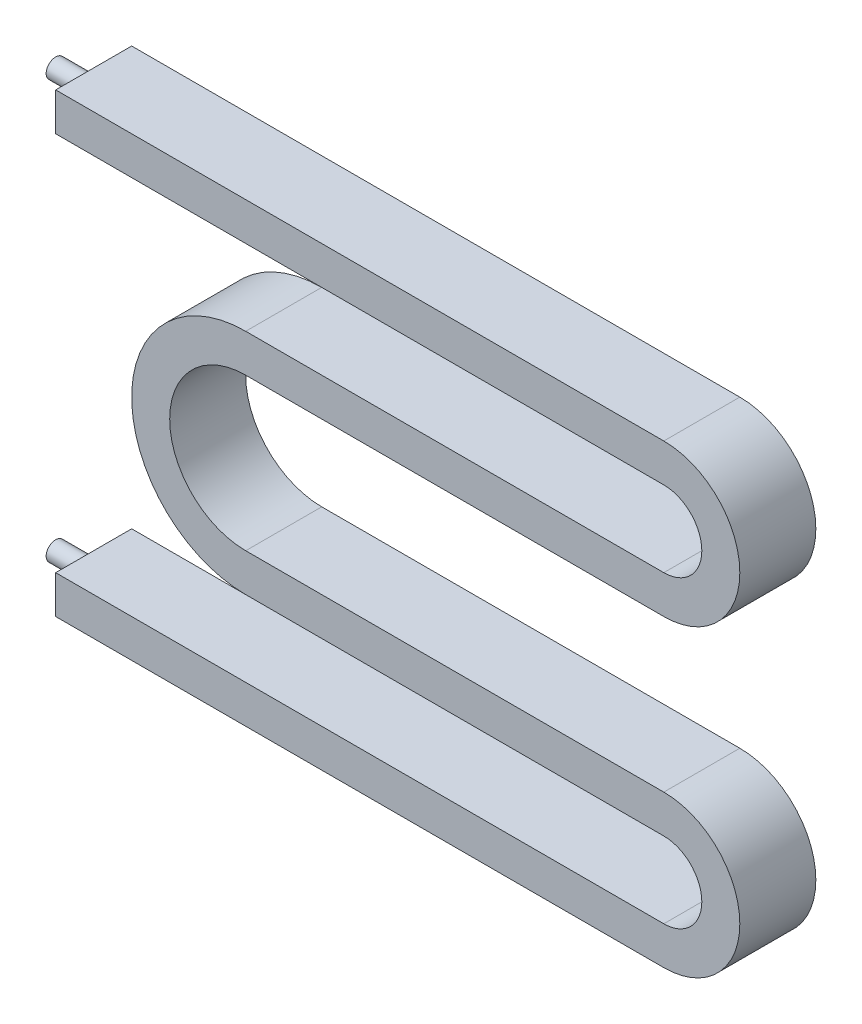
ISO-10303-21;
HEADER;
FILE_DESCRIPTION(('STEP AP214'),'2;1');
FILE_NAME('part.step','',(''),(''),'','','');
FILE_SCHEMA(('AUTOMOTIVE_DESIGN { 1 0 10303 214 1 1 1 1 }'));
ENDSEC;
DATA;
#1=APPLICATION_CONTEXT('core data for automotive mechanical design processes');
#2=APPLICATION_PROTOCOL_DEFINITION('international standard','automotive_design',2000,#1);
#3=PRODUCT_CONTEXT('',#1,'mechanical');
#4=PRODUCT('Part','Part','',(#3));
#5=PRODUCT_RELATED_PRODUCT_CATEGORY('part','',(#4));
#6=PRODUCT_DEFINITION_FORMATION('','',#4);
#7=PRODUCT_DEFINITION_CONTEXT('part definition',#1,'design');
#8=PRODUCT_DEFINITION('design','',#6,#7);
#9=PRODUCT_DEFINITION_SHAPE('','',#8);
#10=(LENGTH_UNIT() NAMED_UNIT(*) SI_UNIT(.MILLI.,.METRE.));
#11=(NAMED_UNIT(*) PLANE_ANGLE_UNIT() SI_UNIT($,.RADIAN.));
#12=(NAMED_UNIT(*) SI_UNIT($,.STERADIAN.) SOLID_ANGLE_UNIT());
#13=UNCERTAINTY_MEASURE_WITH_UNIT(LENGTH_MEASURE(1.E-05),#10,'distance_accuracy_value','');
#14=(GEOMETRIC_REPRESENTATION_CONTEXT(3) GLOBAL_UNCERTAINTY_ASSIGNED_CONTEXT((#13)) GLOBAL_UNIT_ASSIGNED_CONTEXT((#10,
#11,#12)) REPRESENTATION_CONTEXT('',''));
#15=CARTESIAN_POINT('',(0.,0.,0.));
#16=DIRECTION('',(0.,0.,1.));
#17=DIRECTION('',(1.,0.,0.));
#18=AXIS2_PLACEMENT_3D('',#15,#16,#17);
#19=CARTESIAN_POINT('',(0.,0.,10.));
#20=DIRECTION('',(1.,0.,0.));
#21=DIRECTION('',(0.,0.,-1.));
#22=AXIS2_PLACEMENT_3D('',#19,#20,#21);
#23=PLANE('',#22);
#24=CARTESIAN_POINT('',(0.,-2.5,5.));
#25=DIRECTION('',(1.,0.,0.));
#26=DIRECTION('',(0.,0.,-1.));
#27=AXIS2_PLACEMENT_3D('',#24,#25,#26);
#28=CIRCLE('',#27,1.25);
#29=CARTESIAN_POINT('',(0.,-2.5,3.75));
#30=VERTEX_POINT('',#29);
#31=EDGE_CURVE('E45',#30,#30,#28,.F.);
#32=ORIENTED_EDGE('',*,*,#31,.F.);
#33=EDGE_LOOP('',(#32));
#34=FACE_BOUND('',#33,.T.);
#35=DIRECTION('',(0.,-1.,0.));
#36=VECTOR('',#35,1.);
#37=CARTESIAN_POINT('',(0.,0.,0.));
#38=LINE('',#37,#36);
#39=CARTESIAN_POINT('',(0.,0.,0.));
#40=VERTEX_POINT('',#39);
#41=CARTESIAN_POINT('',(0.,-5.,0.));
#42=VERTEX_POINT('',#41);
#43=EDGE_CURVE('E182',#40,#42,#38,.T.);
#44=ORIENTED_EDGE('',*,*,#43,.T.);
#45=DIRECTION('',(0.,0.,-1.));
#46=VECTOR('',#45,1.);
#47=CARTESIAN_POINT('',(0.,-5.,10.));
#48=LINE('',#47,#46);
#49=CARTESIAN_POINT('',(0.,-5.,10.));
#50=VERTEX_POINT('',#49);
#51=EDGE_CURVE('E250',#50,#42,#48,.T.);
#52=ORIENTED_EDGE('',*,*,#51,.F.);
#53=DIRECTION('',(0.,-1.,0.));
#54=VECTOR('',#53,1.);
#55=CARTESIAN_POINT('',(0.,0.,10.));
#56=LINE('',#55,#54);
#57=CARTESIAN_POINT('',(0.,0.,10.));
#58=VERTEX_POINT('',#57);
#59=EDGE_CURVE('E213',#58,#50,#56,.T.);
#60=ORIENTED_EDGE('',*,*,#59,.F.);
#61=DIRECTION('',(0.,0.,-1.));
#62=VECTOR('',#61,1.);
#63=CARTESIAN_POINT('',(0.,0.,10.));
#64=LINE('',#63,#62);
#65=EDGE_CURVE('E178',#58,#40,#64,.T.);
#66=ORIENTED_EDGE('',*,*,#65,.T.);
#67=EDGE_LOOP('',(#44,#52,#60,#66));
#68=FACE_BOUND('',#67,.T.);
#69=ADVANCED_FACE('F37',(#34,#68),#23,.F.);
#70=CARTESIAN_POINT('',(0.,-5.,10.));
#71=DIRECTION('',(0.,1.,0.));
#72=DIRECTION('',(0.,0.,1.));
#73=AXIS2_PLACEMENT_3D('',#70,#71,#72);
#74=PLANE('',#73);
#75=DIRECTION('',(1.,0.,0.));
#76=VECTOR('',#75,1.);
#77=CARTESIAN_POINT('',(0.,-5.,0.));
#78=LINE('',#77,#76);
#79=CARTESIAN_POINT('',(80.,-5.,0.));
#80=VERTEX_POINT('',#79);
#81=EDGE_CURVE('E185',#42,#80,#78,.T.);
#82=ORIENTED_EDGE('',*,*,#81,.T.);
#83=DIRECTION('',(0.,0.,-1.));
#84=VECTOR('',#83,1.);
#85=CARTESIAN_POINT('',(80.,-5.,10.));
#86=LINE('',#85,#84);
#87=CARTESIAN_POINT('',(80.,-5.,10.));
#88=VERTEX_POINT('',#87);
#89=EDGE_CURVE('E247',#88,#80,#86,.T.);
#90=ORIENTED_EDGE('',*,*,#89,.F.);
#91=DIRECTION('',(1.,0.,0.));
#92=VECTOR('',#91,1.);
#93=CARTESIAN_POINT('',(0.,-5.,10.));
#94=LINE('',#93,#92);
#95=EDGE_CURVE('E121',#50,#88,#94,.T.);
#96=ORIENTED_EDGE('',*,*,#95,.F.);
#97=ORIENTED_EDGE('',*,*,#51,.T.);
#98=EDGE_LOOP('',(#82,#90,#96,#97));
#99=FACE_BOUND('',#98,.T.);
#100=ADVANCED_FACE('F258',(#99),#74,.F.);
#101=CARTESIAN_POINT('',(80.,-10.,10.));
#102=DIRECTION('',(0.,0.,-1.));
#103=DIRECTION('',(-1.,0.,0.));
#104=AXIS2_PLACEMENT_3D('',#101,#102,#103);
#105=CYLINDRICAL_SURFACE('',#104,5.);
#106=CARTESIAN_POINT('',(80.,-10.,0.));
#107=DIRECTION('',(0.,0.,-1.));
#108=DIRECTION('',(-1.,0.,0.));
#109=AXIS2_PLACEMENT_3D('',#106,#107,#108);
#110=CIRCLE('',#109,5.);
#111=CARTESIAN_POINT('',(80.,-15.,0.));
#112=VERTEX_POINT('',#111);
#113=EDGE_CURVE('E188',#80,#112,#110,.T.);
#114=ORIENTED_EDGE('',*,*,#113,.T.);
#115=DIRECTION('',(0.,0.,-1.));
#116=VECTOR('',#115,1.);
#117=CARTESIAN_POINT('',(80.,-15.,10.));
#118=LINE('',#117,#116);
#119=CARTESIAN_POINT('',(80.,-15.,10.));
#120=VERTEX_POINT('',#119);
#121=EDGE_CURVE('E244',#120,#112,#118,.T.);
#122=ORIENTED_EDGE('',*,*,#121,.F.);
#123=CARTESIAN_POINT('',(80.,-10.,10.));
#124=DIRECTION('',(0.,0.,-1.));
#125=DIRECTION('',(-1.,0.,0.));
#126=AXIS2_PLACEMENT_3D('',#123,#124,#125);
#127=CIRCLE('',#126,5.);
#128=EDGE_CURVE('E350',#88,#120,#127,.T.);
#129=ORIENTED_EDGE('',*,*,#128,.F.);
#130=ORIENTED_EDGE('',*,*,#89,.T.);
#131=EDGE_LOOP('',(#114,#122,#129,#130));
#132=FACE_BOUND('',#131,.T.);
#133=ADVANCED_FACE('F267',(#132),#105,.F.);
#134=CARTESIAN_POINT('',(80.,-15.,10.));
#135=DIRECTION('',(0.,-1.,0.));
#136=DIRECTION('',(0.,0.,-1.));
#137=AXIS2_PLACEMENT_3D('',#134,#135,#136);
#138=PLANE('',#137);
#139=DIRECTION('',(-1.,0.,0.));
#140=VECTOR('',#139,1.);
#141=CARTESIAN_POINT('',(80.,-15.,0.));
#142=LINE('',#141,#140);
#143=CARTESIAN_POINT('',(25.,-15.,0.));
#144=VERTEX_POINT('',#143);
#145=EDGE_CURVE('E190',#112,#144,#142,.T.);
#146=ORIENTED_EDGE('',*,*,#145,.T.);
#147=DIRECTION('',(0.,0.,-1.));
#148=VECTOR('',#147,1.);
#149=CARTESIAN_POINT('',(25.,-15.,10.));
#150=LINE('',#149,#148);
#151=CARTESIAN_POINT('',(25.,-15.,10.));
#152=VERTEX_POINT('',#151);
#153=EDGE_CURVE('E241',#152,#144,#150,.T.);
#154=ORIENTED_EDGE('',*,*,#153,.F.);
#155=DIRECTION('',(-1.,0.,0.));
#156=VECTOR('',#155,1.);
#157=CARTESIAN_POINT('',(80.,-15.,10.));
#158=LINE('',#157,#156);
#159=EDGE_CURVE('E352',#120,#152,#158,.T.);
#160=ORIENTED_EDGE('',*,*,#159,.F.);
#161=ORIENTED_EDGE('',*,*,#121,.T.);
#162=EDGE_LOOP('',(#146,#154,#160,#161));
#163=FACE_BOUND('',#162,.T.);
#164=ADVANCED_FACE('F271',(#163),#138,.F.);
#165=CARTESIAN_POINT('',(25.,-30.,10.));
#166=DIRECTION('',(0.,0.,-1.));
#167=DIRECTION('',(-1.,0.,0.));
#168=AXIS2_PLACEMENT_3D('',#165,#166,#167);
#169=CYLINDRICAL_SURFACE('',#168,15.);
#170=CARTESIAN_POINT('',(25.,-30.,0.));
#171=DIRECTION('',(0.,0.,1.));
#172=DIRECTION('',(1.,0.,0.));
#173=AXIS2_PLACEMENT_3D('',#170,#171,#172);
#174=CIRCLE('',#173,15.);
#175=CARTESIAN_POINT('',(25.,-45.,0.));
#176=VERTEX_POINT('',#175);
#177=EDGE_CURVE('E192',#144,#176,#174,.T.);
#178=ORIENTED_EDGE('',*,*,#177,.T.);
#179=DIRECTION('',(0.,0.,-1.));
#180=VECTOR('',#179,1.);
#181=CARTESIAN_POINT('',(25.,-45.,10.));
#182=LINE('',#181,#180);
#183=CARTESIAN_POINT('',(25.,-45.,10.));
#184=VERTEX_POINT('',#183);
#185=EDGE_CURVE('E238',#184,#176,#182,.T.);
#186=ORIENTED_EDGE('',*,*,#185,.F.);
#187=CARTESIAN_POINT('',(25.,-30.,10.));
#188=DIRECTION('',(0.,0.,1.));
#189=DIRECTION('',(1.,0.,0.));
#190=AXIS2_PLACEMENT_3D('',#187,#188,#189);
#191=CIRCLE('',#190,15.);
#192=EDGE_CURVE('E354',#152,#184,#191,.T.);
#193=ORIENTED_EDGE('',*,*,#192,.F.);
#194=ORIENTED_EDGE('',*,*,#153,.T.);
#195=EDGE_LOOP('',(#178,#186,#193,#194));
#196=FACE_BOUND('',#195,.T.);
#197=ADVANCED_FACE('F277',(#196),#169,.T.);
#198=CARTESIAN_POINT('',(25.,-45.,10.));
#199=DIRECTION('',(0.,1.,0.));
#200=DIRECTION('',(0.,0.,1.));
#201=AXIS2_PLACEMENT_3D('',#198,#199,#200);
#202=PLANE('',#201);
#203=DIRECTION('',(1.,0.,0.));
#204=VECTOR('',#203,1.);
#205=CARTESIAN_POINT('',(25.,-45.,0.));
#206=LINE('',#205,#204);
#207=CARTESIAN_POINT('',(80.,-45.,0.));
#208=VERTEX_POINT('',#207);
#209=EDGE_CURVE('E194',#176,#208,#206,.T.);
#210=ORIENTED_EDGE('',*,*,#209,.T.);
#211=DIRECTION('',(0.,0.,-1.));
#212=VECTOR('',#211,1.);
#213=CARTESIAN_POINT('',(80.,-45.,10.));
#214=LINE('',#213,#212);
#215=CARTESIAN_POINT('',(80.,-45.,10.));
#216=VERTEX_POINT('',#215);
#217=EDGE_CURVE('E235',#216,#208,#214,.T.);
#218=ORIENTED_EDGE('',*,*,#217,.F.);
#219=DIRECTION('',(1.,0.,0.));
#220=VECTOR('',#219,1.);
#221=CARTESIAN_POINT('',(25.,-45.,10.));
#222=LINE('',#221,#220);
#223=EDGE_CURVE('E356',#184,#216,#222,.T.);
#224=ORIENTED_EDGE('',*,*,#223,.F.);
#225=ORIENTED_EDGE('',*,*,#185,.T.);
#226=EDGE_LOOP('',(#210,#218,#224,#225));
#227=FACE_BOUND('',#226,.T.);
#228=ADVANCED_FACE('F281',(#227),#202,.F.);
#229=CARTESIAN_POINT('',(80.,-50.,10.));
#230=DIRECTION('',(0.,0.,-1.));
#231=DIRECTION('',(-1.,0.,0.));
#232=AXIS2_PLACEMENT_3D('',#229,#230,#231);
#233=CYLINDRICAL_SURFACE('',#232,5.);
#234=CARTESIAN_POINT('',(80.,-50.,0.));
#235=DIRECTION('',(0.,0.,-1.));
#236=DIRECTION('',(-1.,0.,0.));
#237=AXIS2_PLACEMENT_3D('',#234,#235,#236);
#238=CIRCLE('',#237,5.);
#239=CARTESIAN_POINT('',(80.,-55.,0.));
#240=VERTEX_POINT('',#239);
#241=EDGE_CURVE('E196',#208,#240,#238,.T.);
#242=ORIENTED_EDGE('',*,*,#241,.T.);
#243=DIRECTION('',(0.,0.,-1.));
#244=VECTOR('',#243,1.);
#245=CARTESIAN_POINT('',(80.,-55.,10.));
#246=LINE('',#245,#244);
#247=CARTESIAN_POINT('',(80.,-55.,10.));
#248=VERTEX_POINT('',#247);
#249=EDGE_CURVE('E232',#248,#240,#246,.T.);
#250=ORIENTED_EDGE('',*,*,#249,.F.);
#251=CARTESIAN_POINT('',(80.,-50.,10.));
#252=DIRECTION('',(0.,0.,-1.));
#253=DIRECTION('',(-1.,0.,0.));
#254=AXIS2_PLACEMENT_3D('',#251,#252,#253);
#255=CIRCLE('',#254,5.);
#256=EDGE_CURVE('E358',#216,#248,#255,.T.);
#257=ORIENTED_EDGE('',*,*,#256,.F.);
#258=ORIENTED_EDGE('',*,*,#217,.T.);
#259=EDGE_LOOP('',(#242,#250,#257,#258));
#260=FACE_BOUND('',#259,.T.);
#261=ADVANCED_FACE('F285',(#260),#233,.F.);
#262=CARTESIAN_POINT('',(80.,-55.,10.));
#263=DIRECTION('',(0.,-1.,0.));
#264=DIRECTION('',(0.,0.,-1.));
#265=AXIS2_PLACEMENT_3D('',#262,#263,#264);
#266=PLANE('',#265);
#267=DIRECTION('',(-1.,0.,0.));
#268=VECTOR('',#267,1.);
#269=CARTESIAN_POINT('',(80.,-55.,0.));
#270=LINE('',#269,#268);
#271=CARTESIAN_POINT('',(0.,-55.,0.));
#272=VERTEX_POINT('',#271);
#273=EDGE_CURVE('E198',#240,#272,#270,.T.);
#274=ORIENTED_EDGE('',*,*,#273,.T.);
#275=DIRECTION('',(0.,0.,-1.));
#276=VECTOR('',#275,1.);
#277=CARTESIAN_POINT('',(0.,-55.,10.));
#278=LINE('',#277,#276);
#279=CARTESIAN_POINT('',(0.,-55.,10.));
#280=VERTEX_POINT('',#279);
#281=EDGE_CURVE('E229',#280,#272,#278,.T.);
#282=ORIENTED_EDGE('',*,*,#281,.F.);
#283=DIRECTION('',(-1.,0.,0.));
#284=VECTOR('',#283,1.);
#285=CARTESIAN_POINT('',(80.,-55.,10.));
#286=LINE('',#285,#284);
#287=EDGE_CURVE('E360',#248,#280,#286,.T.);
#288=ORIENTED_EDGE('',*,*,#287,.F.);
#289=ORIENTED_EDGE('',*,*,#249,.T.);
#290=EDGE_LOOP('',(#274,#282,#288,#289));
#291=FACE_BOUND('',#290,.T.);
#292=ADVANCED_FACE('F289',(#291),#266,.F.);
#293=CARTESIAN_POINT('',(0.,-55.,10.));
#294=DIRECTION('',(1.,0.,0.));
#295=DIRECTION('',(0.,0.,-1.));
#296=AXIS2_PLACEMENT_3D('',#293,#294,#295);
#297=PLANE('',#296);
#298=CARTESIAN_POINT('',(0.,-57.5,4.99999999999999));
#299=DIRECTION('',(1.,0.,0.));
#300=DIRECTION('',(0.,0.,-1.));
#301=AXIS2_PLACEMENT_3D('',#298,#299,#300);
#302=CIRCLE('',#301,1.25);
#303=CARTESIAN_POINT('',(0.,-57.5,3.74999999999999));
#304=VERTEX_POINT('',#303);
#305=EDGE_CURVE('E11',#304,#304,#302,.F.);
#306=ORIENTED_EDGE('',*,*,#305,.F.);
#307=EDGE_LOOP('',(#306));
#308=FACE_BOUND('',#307,.T.);
#309=DIRECTION('',(0.,-1.,0.));
#310=VECTOR('',#309,1.);
#311=CARTESIAN_POINT('',(0.,-55.,0.));
#312=LINE('',#311,#310);
#313=CARTESIAN_POINT('',(0.,-60.,0.));
#314=VERTEX_POINT('',#313);
#315=EDGE_CURVE('E200',#272,#314,#312,.T.);
#316=ORIENTED_EDGE('',*,*,#315,.T.);
#317=DIRECTION('',(0.,0.,-1.));
#318=VECTOR('',#317,1.);
#319=CARTESIAN_POINT('',(0.,-60.,10.));
#320=LINE('',#319,#318);
#321=CARTESIAN_POINT('',(0.,-60.,10.));
#322=VERTEX_POINT('',#321);
#323=EDGE_CURVE('E226',#322,#314,#320,.T.);
#324=ORIENTED_EDGE('',*,*,#323,.F.);
#325=DIRECTION('',(0.,-1.,0.));
#326=VECTOR('',#325,1.);
#327=CARTESIAN_POINT('',(0.,-55.,10.));
#328=LINE('',#327,#326);
#329=EDGE_CURVE('E362',#280,#322,#328,.T.);
#330=ORIENTED_EDGE('',*,*,#329,.F.);
#331=ORIENTED_EDGE('',*,*,#281,.T.);
#332=EDGE_LOOP('',(#316,#324,#330,#331));
#333=FACE_BOUND('',#332,.T.);
#334=ADVANCED_FACE('F293',(#308,#333),#297,.F.);
#335=CARTESIAN_POINT('',(80.,-60.,10.));
#336=DIRECTION('',(0.,1.,0.));
#337=DIRECTION('',(-1.,0.,0.));
#338=AXIS2_PLACEMENT_3D('',#335,#336,#337);
#339=PLANE('',#338);
#340=DIRECTION('',(1.,0.,0.));
#341=VECTOR('',#340,1.);
#342=CARTESIAN_POINT('',(80.,-60.,0.));
#343=LINE('',#342,#341);
#344=CARTESIAN_POINT('',(80.,-60.,0.));
#345=VERTEX_POINT('',#344);
#346=EDGE_CURVE('E202',#314,#345,#343,.T.);
#347=ORIENTED_EDGE('',*,*,#346,.T.);
#348=DIRECTION('',(0.,0.,-1.));
#349=VECTOR('',#348,1.);
#350=CARTESIAN_POINT('',(80.,-60.,10.));
#351=LINE('',#350,#349);
#352=CARTESIAN_POINT('',(80.,-60.,10.));
#353=VERTEX_POINT('',#352);
#354=EDGE_CURVE('E223',#353,#345,#351,.T.);
#355=ORIENTED_EDGE('',*,*,#354,.F.);
#356=DIRECTION('',(1.,0.,0.));
#357=VECTOR('',#356,1.);
#358=CARTESIAN_POINT('',(80.,-60.,10.));
#359=LINE('',#358,#357);
#360=EDGE_CURVE('E364',#322,#353,#359,.T.);
#361=ORIENTED_EDGE('',*,*,#360,.F.);
#362=ORIENTED_EDGE('',*,*,#323,.T.);
#363=EDGE_LOOP('',(#347,#355,#361,#362));
#364=FACE_BOUND('',#363,.T.);
#365=ADVANCED_FACE('F297',(#364),#339,.F.);
#366=CARTESIAN_POINT('',(80.,-50.,10.));
#367=DIRECTION('',(0.,0.,-1.));
#368=DIRECTION('',(-1.,0.,0.));
#369=AXIS2_PLACEMENT_3D('',#366,#367,#368);
#370=CYLINDRICAL_SURFACE('',#369,10.);
#371=CARTESIAN_POINT('',(80.,-50.,0.));
#372=DIRECTION('',(0.,0.,1.));
#373=DIRECTION('',(-1.,0.,0.));
#374=AXIS2_PLACEMENT_3D('',#371,#372,#373);
#375=CIRCLE('',#374,10.);
#376=CARTESIAN_POINT('',(80.,-40.,0.));
#377=VERTEX_POINT('',#376);
#378=EDGE_CURVE('E204',#345,#377,#375,.T.);
#379=ORIENTED_EDGE('',*,*,#378,.T.);
#380=DIRECTION('',(0.,0.,-1.));
#381=VECTOR('',#380,1.);
#382=CARTESIAN_POINT('',(80.,-40.,10.));
#383=LINE('',#382,#381);
#384=CARTESIAN_POINT('',(80.,-40.,10.));
#385=VERTEX_POINT('',#384);
#386=EDGE_CURVE('E220',#385,#377,#383,.T.);
#387=ORIENTED_EDGE('',*,*,#386,.F.);
#388=CARTESIAN_POINT('',(80.,-50.,10.));
#389=DIRECTION('',(0.,0.,1.));
#390=DIRECTION('',(-1.,0.,0.));
#391=AXIS2_PLACEMENT_3D('',#388,#389,#390);
#392=CIRCLE('',#391,10.);
#393=EDGE_CURVE('E366',#353,#385,#392,.T.);
#394=ORIENTED_EDGE('',*,*,#393,.F.);
#395=ORIENTED_EDGE('',*,*,#354,.T.);
#396=EDGE_LOOP('',(#379,#387,#394,#395));
#397=FACE_BOUND('',#396,.T.);
#398=ADVANCED_FACE('F301',(#397),#370,.T.);
#399=CARTESIAN_POINT('',(25.,-40.,10.));
#400=DIRECTION('',(0.,-1.,0.));
#401=DIRECTION('',(1.,0.,0.));
#402=AXIS2_PLACEMENT_3D('',#399,#400,#401);
#403=PLANE('',#402);
#404=DIRECTION('',(-1.,0.,0.));
#405=VECTOR('',#404,1.);
#406=CARTESIAN_POINT('',(25.,-40.,0.));
#407=LINE('',#406,#405);
#408=CARTESIAN_POINT('',(25.,-40.,0.));
#409=VERTEX_POINT('',#408);
#410=EDGE_CURVE('E206',#377,#409,#407,.T.);
#411=ORIENTED_EDGE('',*,*,#410,.T.);
#412=DIRECTION('',(0.,0.,-1.));
#413=VECTOR('',#412,1.);
#414=CARTESIAN_POINT('',(25.,-40.,10.));
#415=LINE('',#414,#413);
#416=CARTESIAN_POINT('',(25.,-40.,10.));
#417=VERTEX_POINT('',#416);
#418=EDGE_CURVE('E217',#417,#409,#415,.T.);
#419=ORIENTED_EDGE('',*,*,#418,.F.);
#420=DIRECTION('',(-1.,0.,0.));
#421=VECTOR('',#420,1.);
#422=CARTESIAN_POINT('',(25.,-40.,10.));
#423=LINE('',#422,#421);
#424=EDGE_CURVE('E368',#385,#417,#423,.T.);
#425=ORIENTED_EDGE('',*,*,#424,.F.);
#426=ORIENTED_EDGE('',*,*,#386,.T.);
#427=EDGE_LOOP('',(#411,#419,#425,#426));
#428=FACE_BOUND('',#427,.T.);
#429=ADVANCED_FACE('F305',(#428),#403,.F.);
#430=CARTESIAN_POINT('',(25.,-30.,10.));
#431=DIRECTION('',(0.,0.,-1.));
#432=DIRECTION('',(-1.,0.,0.));
#433=AXIS2_PLACEMENT_3D('',#430,#431,#432);
#434=CYLINDRICAL_SURFACE('',#433,10.);
#435=CARTESIAN_POINT('',(25.,-30.,0.));
#436=DIRECTION('',(0.,0.,-1.));
#437=DIRECTION('',(1.,0.,0.));
#438=AXIS2_PLACEMENT_3D('',#435,#436,#437);
#439=CIRCLE('',#438,10.);
#440=CARTESIAN_POINT('',(25.,-20.,0.));
#441=VERTEX_POINT('',#440);
#442=EDGE_CURVE('E208',#409,#441,#439,.T.);
#443=ORIENTED_EDGE('',*,*,#442,.T.);
#444=DIRECTION('',(0.,0.,-1.));
#445=VECTOR('',#444,1.);
#446=CARTESIAN_POINT('',(25.,-20.,10.));
#447=LINE('',#446,#445);
#448=CARTESIAN_POINT('',(25.,-20.,10.));
#449=VERTEX_POINT('',#448);
#450=EDGE_CURVE('E173',#449,#441,#447,.T.);
#451=ORIENTED_EDGE('',*,*,#450,.F.);
#452=CARTESIAN_POINT('',(25.,-30.,10.));
#453=DIRECTION('',(0.,0.,-1.));
#454=DIRECTION('',(1.,0.,0.));
#455=AXIS2_PLACEMENT_3D('',#452,#453,#454);
#456=CIRCLE('',#455,10.);
#457=EDGE_CURVE('E164',#417,#449,#456,.T.);
#458=ORIENTED_EDGE('',*,*,#457,.F.);
#459=ORIENTED_EDGE('',*,*,#418,.T.);
#460=EDGE_LOOP('',(#443,#451,#458,#459));
#461=FACE_BOUND('',#460,.T.);
#462=ADVANCED_FACE('F309',(#461),#434,.F.);
#463=CARTESIAN_POINT('',(80.,-20.,10.));
#464=DIRECTION('',(0.,1.,0.));
#465=DIRECTION('',(-1.,0.,0.));
#466=AXIS2_PLACEMENT_3D('',#463,#464,#465);
#467=PLANE('',#466);
#468=DIRECTION('',(1.,0.,0.));
#469=VECTOR('',#468,1.);
#470=CARTESIAN_POINT('',(80.,-20.,0.));
#471=LINE('',#470,#469);
#472=CARTESIAN_POINT('',(80.,-20.,0.));
#473=VERTEX_POINT('',#472);
#474=EDGE_CURVE('E172',#441,#473,#471,.T.);
#475=ORIENTED_EDGE('',*,*,#474,.T.);
#476=DIRECTION('',(0.,0.,-1.));
#477=VECTOR('',#476,1.);
#478=CARTESIAN_POINT('',(80.,-20.,10.));
#479=LINE('',#478,#477);
#480=CARTESIAN_POINT('',(80.,-20.,10.));
#481=VERTEX_POINT('',#480);
#482=EDGE_CURVE('E169',#481,#473,#479,.T.);
#483=ORIENTED_EDGE('',*,*,#482,.F.);
#484=DIRECTION('',(1.,0.,0.));
#485=VECTOR('',#484,1.);
#486=CARTESIAN_POINT('',(80.,-20.,10.));
#487=LINE('',#486,#485);
#488=EDGE_CURVE('E158',#449,#481,#487,.T.);
#489=ORIENTED_EDGE('',*,*,#488,.F.);
#490=ORIENTED_EDGE('',*,*,#450,.T.);
#491=EDGE_LOOP('',(#475,#483,#489,#490));
#492=FACE_BOUND('',#491,.T.);
#493=ADVANCED_FACE('F170',(#492),#467,.F.);
#494=CARTESIAN_POINT('',(80.,-10.,10.));
#495=DIRECTION('',(0.,0.,-1.));
#496=DIRECTION('',(-1.,0.,0.));
#497=AXIS2_PLACEMENT_3D('',#494,#495,#496);
#498=CYLINDRICAL_SURFACE('',#497,10.);
#499=CARTESIAN_POINT('',(80.,-10.,0.));
#500=DIRECTION('',(0.,0.,1.));
#501=DIRECTION('',(-1.,0.,0.));
#502=AXIS2_PLACEMENT_3D('',#499,#500,#501);
#503=CIRCLE('',#502,10.);
#504=CARTESIAN_POINT('',(80.,0.,0.));
#505=VERTEX_POINT('',#504);
#506=EDGE_CURVE('E106',#473,#505,#503,.T.);
#507=ORIENTED_EDGE('',*,*,#506,.T.);
#508=DIRECTION('',(0.,0.,-1.));
#509=VECTOR('',#508,1.);
#510=CARTESIAN_POINT('',(80.,0.,10.));
#511=LINE('',#510,#509);
#512=CARTESIAN_POINT('',(80.,0.,10.));
#513=VERTEX_POINT('',#512);
#514=EDGE_CURVE('E174',#513,#505,#511,.T.);
#515=ORIENTED_EDGE('',*,*,#514,.F.);
#516=CARTESIAN_POINT('',(80.,-10.,10.));
#517=DIRECTION('',(0.,0.,1.));
#518=DIRECTION('',(-1.,0.,0.));
#519=AXIS2_PLACEMENT_3D('',#516,#517,#518);
#520=CIRCLE('',#519,10.);
#521=EDGE_CURVE('E162',#481,#513,#520,.T.);
#522=ORIENTED_EDGE('',*,*,#521,.F.);
#523=ORIENTED_EDGE('',*,*,#482,.T.);
#524=EDGE_LOOP('',(#507,#515,#522,#523));
#525=FACE_BOUND('',#524,.T.);
#526=ADVANCED_FACE('F176',(#525),#498,.T.);
#527=CARTESIAN_POINT('',(0.,0.,10.));
#528=DIRECTION('',(0.,-1.,0.));
#529=DIRECTION('',(0.,0.,-1.));
#530=AXIS2_PLACEMENT_3D('',#527,#528,#529);
#531=PLANE('',#530);
#532=DIRECTION('',(-1.,0.,0.));
#533=VECTOR('',#532,1.);
#534=CARTESIAN_POINT('',(0.,0.,0.));
#535=LINE('',#534,#533);
#536=EDGE_CURVE('E112',#505,#40,#535,.T.);
#537=ORIENTED_EDGE('',*,*,#536,.T.);
#538=ORIENTED_EDGE('',*,*,#65,.F.);
#539=DIRECTION('',(-1.,0.,0.));
#540=VECTOR('',#539,1.);
#541=CARTESIAN_POINT('',(0.,0.,10.));
#542=LINE('',#541,#540);
#543=EDGE_CURVE('E53',#513,#58,#542,.T.);
#544=ORIENTED_EDGE('',*,*,#543,.F.);
#545=ORIENTED_EDGE('',*,*,#514,.T.);
#546=EDGE_LOOP('',(#537,#538,#544,#545));
#547=FACE_BOUND('',#546,.T.);
#548=ADVANCED_FACE('F318',(#547),#531,.F.);
#549=CARTESIAN_POINT('',(80.,-10.,10.));
#550=DIRECTION('',(0.,0.,-1.));
#551=DIRECTION('',(-1.,0.,0.));
#552=AXIS2_PLACEMENT_3D('',#549,#550,#551);
#553=PLANE('',#552);
#554=ORIENTED_EDGE('',*,*,#59,.T.);
#555=ORIENTED_EDGE('',*,*,#95,.T.);
#556=ORIENTED_EDGE('',*,*,#128,.T.);
#557=ORIENTED_EDGE('',*,*,#159,.T.);
#558=ORIENTED_EDGE('',*,*,#192,.T.);
#559=ORIENTED_EDGE('',*,*,#223,.T.);
#560=ORIENTED_EDGE('',*,*,#256,.T.);
#561=ORIENTED_EDGE('',*,*,#287,.T.);
#562=ORIENTED_EDGE('',*,*,#329,.T.);
#563=ORIENTED_EDGE('',*,*,#360,.T.);
#564=ORIENTED_EDGE('',*,*,#393,.T.);
#565=ORIENTED_EDGE('',*,*,#424,.T.);
#566=ORIENTED_EDGE('',*,*,#457,.T.);
#567=ORIENTED_EDGE('',*,*,#488,.T.);
#568=ORIENTED_EDGE('',*,*,#521,.T.);
#569=ORIENTED_EDGE('',*,*,#543,.T.);
#570=EDGE_LOOP('',(#554,#555,#556,#557,#558,#559,#560,#561,#562,#563,#564,#565,#566,#567,#568,#569));
#571=FACE_BOUND('',#570,.T.);
#572=ADVANCED_FACE('F160',(#571),#553,.F.);
#573=CARTESIAN_POINT('',(80.,-10.,0.));
#574=DIRECTION('',(0.,0.,-1.));
#575=DIRECTION('',(-1.,0.,0.));
#576=AXIS2_PLACEMENT_3D('',#573,#574,#575);
#577=PLANE('',#576);
#578=ORIENTED_EDGE('',*,*,#43,.F.);
#579=ORIENTED_EDGE('',*,*,#536,.F.);
#580=ORIENTED_EDGE('',*,*,#506,.F.);
#581=ORIENTED_EDGE('',*,*,#474,.F.);
#582=ORIENTED_EDGE('',*,*,#442,.F.);
#583=ORIENTED_EDGE('',*,*,#410,.F.);
#584=ORIENTED_EDGE('',*,*,#378,.F.);
#585=ORIENTED_EDGE('',*,*,#346,.F.);
#586=ORIENTED_EDGE('',*,*,#315,.F.);
#587=ORIENTED_EDGE('',*,*,#273,.F.);
#588=ORIENTED_EDGE('',*,*,#241,.F.);
#589=ORIENTED_EDGE('',*,*,#209,.F.);
#590=ORIENTED_EDGE('',*,*,#177,.F.);
#591=ORIENTED_EDGE('',*,*,#145,.F.);
#592=ORIENTED_EDGE('',*,*,#113,.F.);
#593=ORIENTED_EDGE('',*,*,#81,.F.);
#594=EDGE_LOOP('',(#578,#579,#580,#581,#582,#583,#584,#585,#586,#587,#588,#589,#590,#591,#592,#593));
#595=FACE_BOUND('',#594,.T.);
#596=ADVANCED_FACE('F263',(#595),#577,.T.);
#597=CARTESIAN_POINT('',(-5.,-2.5,5.));
#598=DIRECTION('',(1.,0.,0.));
#599=DIRECTION('',(0.,0.,-1.));
#600=AXIS2_PLACEMENT_3D('',#597,#598,#599);
#601=CYLINDRICAL_SURFACE('',#600,1.25);
#602=CARTESIAN_POINT('',(-5.,-2.5,5.));
#603=DIRECTION('',(-1.,0.,0.));
#604=DIRECTION('',(0.,0.,1.));
#605=AXIS2_PLACEMENT_3D('',#602,#603,#604);
#606=CIRCLE('',#605,1.25);
#607=CARTESIAN_POINT('',(-5.,-2.5,6.25));
#608=VERTEX_POINT('',#607);
#609=EDGE_CURVE('E186',#608,#608,#606,.T.);
#610=ORIENTED_EDGE('',*,*,#609,.F.);
#611=EDGE_LOOP('',(#610));
#612=FACE_BOUND('',#611,.T.);
#613=ORIENTED_EDGE('',*,*,#31,.T.);
#614=EDGE_LOOP('',(#613));
#615=FACE_BOUND('',#614,.T.);
#616=ADVANCED_FACE('F254',(#612,#615),#601,.T.);
#617=CARTESIAN_POINT('',(-5.,-2.5,5.));
#618=DIRECTION('',(-1.,0.,0.));
#619=DIRECTION('',(0.,0.,1.));
#620=AXIS2_PLACEMENT_3D('',#617,#618,#619);
#621=PLANE('',#620);
#622=ORIENTED_EDGE('',*,*,#609,.T.);
#623=EDGE_LOOP('',(#622));
#624=FACE_BOUND('',#623,.T.);
#625=ADVANCED_FACE('F327',(#624),#621,.T.);
#626=CARTESIAN_POINT('',(-5.,-57.5,4.99999999999999));
#627=DIRECTION('',(1.,0.,0.));
#628=DIRECTION('',(0.,0.,-1.));
#629=AXIS2_PLACEMENT_3D('',#626,#627,#628);
#630=CYLINDRICAL_SURFACE('',#629,1.25);
#631=CARTESIAN_POINT('',(-5.,-57.5,4.99999999999999));
#632=DIRECTION('',(-1.,0.,0.));
#633=DIRECTION('',(0.,0.,1.));
#634=AXIS2_PLACEMENT_3D('',#631,#632,#633);
#635=CIRCLE('',#634,1.25);
#636=CARTESIAN_POINT('',(-5.,-57.5,6.24999999999999));
#637=VERTEX_POINT('',#636);
#638=EDGE_CURVE('E343',#637,#637,#635,.T.);
#639=ORIENTED_EDGE('',*,*,#638,.F.);
#640=EDGE_LOOP('',(#639));
#641=FACE_BOUND('',#640,.T.);
#642=ORIENTED_EDGE('',*,*,#305,.T.);
#643=EDGE_LOOP('',(#642));
#644=FACE_BOUND('',#643,.T.);
#645=ADVANCED_FACE('F331',(#641,#644),#630,.T.);
#646=CARTESIAN_POINT('',(-5.,-57.5,4.99999999999999));
#647=DIRECTION('',(-1.,0.,0.));
#648=DIRECTION('',(0.,0.,1.));
#649=AXIS2_PLACEMENT_3D('',#646,#647,#648);
#650=PLANE('',#649);
#651=ORIENTED_EDGE('',*,*,#638,.T.);
#652=EDGE_LOOP('',(#651));
#653=FACE_BOUND('',#652,.T.);
#654=ADVANCED_FACE('F335',(#653),#650,.T.);
#655=CLOSED_SHELL('',(#69,#100,#133,#164,#197,#228,#261,#292,#334,#365,#398,#429,#462,#493,#526,
#548,#572,#596,#616,#625,#645,#654));
#656=MANIFOLD_SOLID_BREP('B2',#655);
#657=ADVANCED_BREP_SHAPE_REPRESENTATION('',(#18,#656),#14);
#658=SHAPE_DEFINITION_REPRESENTATION(#9,#657);
ENDSEC;
END-ISO-10303-21;
